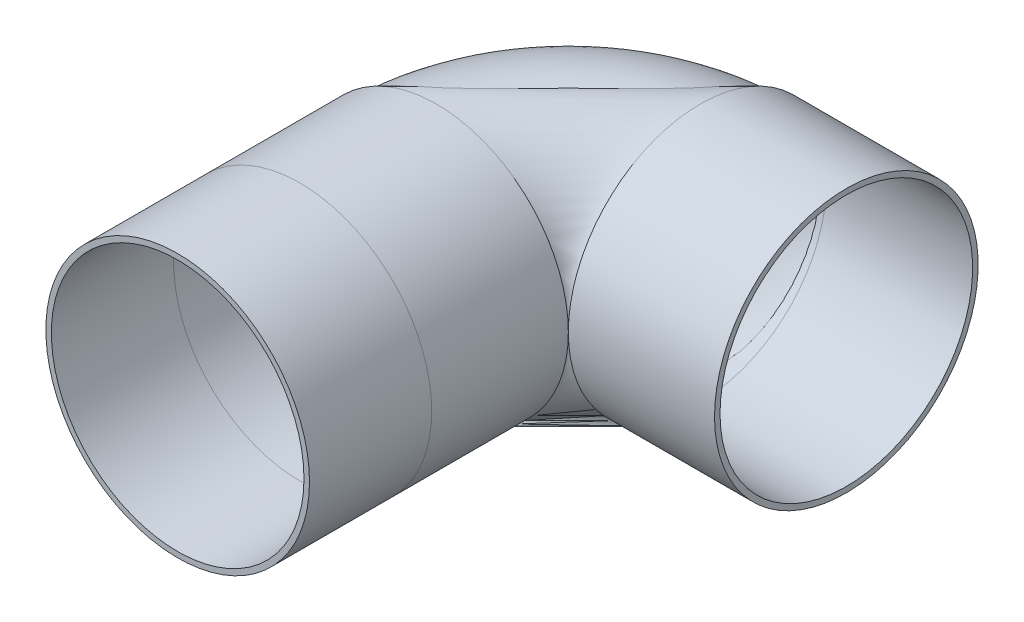
ISO-10303-21;
HEADER;
FILE_DESCRIPTION(('STEP AP214'),'2;1');
FILE_NAME('part.step','',(''),(''),'','','');
FILE_SCHEMA(('AUTOMOTIVE_DESIGN { 1 0 10303 214 1 1 1 1 }'));
ENDSEC;
DATA;
#1=APPLICATION_CONTEXT('core data for automotive mechanical design processes');
#2=APPLICATION_PROTOCOL_DEFINITION('international standard','automotive_design',2000,#1);
#3=PRODUCT_CONTEXT('',#1,'mechanical');
#4=PRODUCT('Part','Part','',(#3));
#5=PRODUCT_RELATED_PRODUCT_CATEGORY('part','',(#4));
#6=PRODUCT_DEFINITION_FORMATION('','',#4);
#7=PRODUCT_DEFINITION_CONTEXT('part definition',#1,'design');
#8=PRODUCT_DEFINITION('design','',#6,#7);
#9=PRODUCT_DEFINITION_SHAPE('','',#8);
#10=(LENGTH_UNIT() NAMED_UNIT(*) SI_UNIT(.MILLI.,.METRE.));
#11=(NAMED_UNIT(*) PLANE_ANGLE_UNIT() SI_UNIT($,.RADIAN.));
#12=(NAMED_UNIT(*) SI_UNIT($,.STERADIAN.) SOLID_ANGLE_UNIT());
#13=UNCERTAINTY_MEASURE_WITH_UNIT(LENGTH_MEASURE(1.E-05),#10,'distance_accuracy_value','');
#14=(GEOMETRIC_REPRESENTATION_CONTEXT(3) GLOBAL_UNCERTAINTY_ASSIGNED_CONTEXT((#13)) GLOBAL_UNIT_ASSIGNED_CONTEXT((#10,
#11,#12)) REPRESENTATION_CONTEXT('',''));
#15=CARTESIAN_POINT('',(0.,0.,0.));
#16=DIRECTION('',(0.,0.,1.));
#17=DIRECTION('',(1.,0.,0.));
#18=AXIS2_PLACEMENT_3D('',#15,#16,#17);
#19=CARTESIAN_POINT('',(116.,0.,-55.));
#20=DIRECTION('',(-1.,0.,0.));
#21=DIRECTION('',(0.,0.,1.));
#22=AXIS2_PLACEMENT_3D('',#19,#20,#21);
#23=CYLINDRICAL_SURFACE('',#22,55.);
#24=CARTESIAN_POINT('',(55.,0.,-55.));
#25=DIRECTION('',(-1.,0.,0.));
#26=DIRECTION('',(0.,0.,1.));
#27=AXIS2_PLACEMENT_3D('',#24,#25,#26);
#28=CIRCLE('',#27,55.);
#29=CARTESIAN_POINT('',(55.,0.,0.));
#30=VERTEX_POINT('',#29);
#31=EDGE_CURVE('E53',#30,#30,#28,.T.);
#32=ORIENTED_EDGE('',*,*,#31,.F.);
#33=EDGE_LOOP('',(#32));
#34=FACE_BOUND('',#33,.T.);
#35=CARTESIAN_POINT('',(116.,0.,-55.));
#36=DIRECTION('',(-1.,0.,0.));
#37=DIRECTION('',(0.,0.,1.));
#38=AXIS2_PLACEMENT_3D('',#35,#36,#37);
#39=CIRCLE('',#38,55.);
#40=CARTESIAN_POINT('',(116.,0.,0.));
#41=VERTEX_POINT('',#40);
#42=EDGE_CURVE('E63',#41,#41,#39,.T.);
#43=ORIENTED_EDGE('',*,*,#42,.T.);
#44=EDGE_LOOP('',(#43));
#45=FACE_BOUND('',#44,.T.);
#46=ADVANCED_FACE('F39',(#34,#45),#23,.T.);
#47=CARTESIAN_POINT('',(55.,0.,0.));
#48=DIRECTION('',(0.,1.,0.));
#49=DIRECTION('',(0.,0.,1.));
#50=AXIS2_PLACEMENT_3D('',#47,#48,#49);
#51=TOROIDAL_SURFACE('',#50,55.,55.);
#52=CARTESIAN_POINT('',(0.,0.,0.));
#53=DIRECTION('',(0.,0.,1.));
#54=DIRECTION('',(1.,0.,0.));
#55=AXIS2_PLACEMENT_3D('',#52,#53,#54);
#56=CIRCLE('',#55,55.);
#57=EDGE_CURVE('E59',#30,#30,#56,.T.);
#58=ORIENTED_EDGE('',*,*,#57,.F.);
#59=ORIENTED_EDGE('',*,*,#31,.T.);
#60=EDGE_LOOP('',(#58,#59));
#61=FACE_BOUND('',#60,.T.);
#62=ADVANCED_FACE('F96',(#61),#51,.T.);
#63=CARTESIAN_POINT('',(0.,0.,0.));
#64=DIRECTION('',(0.,0.,1.));
#65=DIRECTION('',(1.,0.,0.));
#66=AXIS2_PLACEMENT_3D('',#63,#64,#65);
#67=CYLINDRICAL_SURFACE('',#66,55.);
#68=CARTESIAN_POINT('',(0.,0.,57.));
#69=DIRECTION('',(0.,0.,1.));
#70=DIRECTION('',(1.,0.,0.));
#71=AXIS2_PLACEMENT_3D('',#68,#69,#70);
#72=CIRCLE('',#71,55.);
#73=CARTESIAN_POINT('',(55.,0.,57.));
#74=VERTEX_POINT('',#73);
#75=EDGE_CURVE('E43',#74,#74,#72,.T.);
#76=ORIENTED_EDGE('',*,*,#75,.F.);
#77=EDGE_LOOP('',(#76));
#78=FACE_BOUND('',#77,.T.);
#79=ORIENTED_EDGE('',*,*,#57,.T.);
#80=EDGE_LOOP('',(#79));
#81=FACE_BOUND('',#80,.T.);
#82=ADVANCED_FACE('F101',(#78,#81),#67,.T.);
#83=CARTESIAN_POINT('',(0.,0.,57.));
#84=DIRECTION('',(0.,0.,1.));
#85=DIRECTION('',(1.,0.,0.));
#86=AXIS2_PLACEMENT_3D('',#83,#84,#85);
#87=CYLINDRICAL_SURFACE('',#86,55.);
#88=CARTESIAN_POINT('',(0.,0.,108.));
#89=DIRECTION('',(0.,0.,1.));
#90=DIRECTION('',(1.,0.,0.));
#91=AXIS2_PLACEMENT_3D('',#88,#89,#90);
#92=CIRCLE('',#91,55.);
#93=CARTESIAN_POINT('',(55.,0.,108.));
#94=VERTEX_POINT('',#93);
#95=EDGE_CURVE('E67',#94,#94,#92,.T.);
#96=ORIENTED_EDGE('',*,*,#95,.F.);
#97=EDGE_LOOP('',(#96));
#98=FACE_BOUND('',#97,.T.);
#99=ORIENTED_EDGE('',*,*,#75,.T.);
#100=EDGE_LOOP('',(#99));
#101=FACE_BOUND('',#100,.T.);
#102=ADVANCED_FACE('F41',(#98,#101),#87,.T.);
#103=CARTESIAN_POINT('',(116.,0.,-55.));
#104=DIRECTION('',(-1.,0.,0.));
#105=DIRECTION('',(0.,0.,1.));
#106=AXIS2_PLACEMENT_3D('',#103,#104,#105);
#107=PLANE('',#106);
#108=CARTESIAN_POINT('',(116.,0.,-55.));
#109=DIRECTION('',(-1.,0.,0.));
#110=DIRECTION('',(0.,0.,1.));
#111=AXIS2_PLACEMENT_3D('',#108,#109,#110);
#112=CIRCLE('',#111,52.7);
#113=CARTESIAN_POINT('',(116.,0.,-2.3));
#114=VERTEX_POINT('',#113);
#115=EDGE_CURVE('E70',#114,#114,#112,.F.);
#116=ORIENTED_EDGE('',*,*,#115,.F.);
#117=EDGE_LOOP('',(#116));
#118=FACE_BOUND('',#117,.T.);
#119=ORIENTED_EDGE('',*,*,#42,.F.);
#120=EDGE_LOOP('',(#119));
#121=FACE_BOUND('',#120,.T.);
#122=ADVANCED_FACE('F89',(#118,#121),#107,.F.);
#123=CARTESIAN_POINT('',(0.,0.,108.));
#124=DIRECTION('',(0.,0.,1.));
#125=DIRECTION('',(1.,0.,0.));
#126=AXIS2_PLACEMENT_3D('',#123,#124,#125);
#127=PLANE('',#126);
#128=CARTESIAN_POINT('',(0.,0.,108.));
#129=DIRECTION('',(0.,0.,1.));
#130=DIRECTION('',(1.,0.,0.));
#131=AXIS2_PLACEMENT_3D('',#128,#129,#130);
#132=CIRCLE('',#131,52.7);
#133=CARTESIAN_POINT('',(52.7,0.,108.));
#134=VERTEX_POINT('',#133);
#135=EDGE_CURVE('E11',#134,#134,#132,.F.);
#136=ORIENTED_EDGE('',*,*,#135,.T.);
#137=EDGE_LOOP('',(#136));
#138=FACE_BOUND('',#137,.T.);
#139=ORIENTED_EDGE('',*,*,#95,.T.);
#140=EDGE_LOOP('',(#139));
#141=FACE_BOUND('',#140,.T.);
#142=ADVANCED_FACE('F92',(#138,#141),#127,.T.);
#143=CARTESIAN_POINT('',(116.,0.,-55.));
#144=DIRECTION('',(-1.,0.,0.));
#145=DIRECTION('',(0.,0.,1.));
#146=AXIS2_PLACEMENT_3D('',#143,#144,#145);
#147=CYLINDRICAL_SURFACE('',#146,52.7);
#148=CARTESIAN_POINT('',(55.,0.,-55.));
#149=DIRECTION('',(-1.,0.,0.));
#150=DIRECTION('',(0.,0.,1.));
#151=AXIS2_PLACEMENT_3D('',#148,#149,#150);
#152=CIRCLE('',#151,52.7);
#153=CARTESIAN_POINT('',(55.,0.,-107.7));
#154=VERTEX_POINT('',#153);
#155=EDGE_CURVE('E79',#154,#154,#152,.F.);
#156=ORIENTED_EDGE('',*,*,#155,.F.);
#157=EDGE_LOOP('',(#156));
#158=FACE_BOUND('',#157,.T.);
#159=ORIENTED_EDGE('',*,*,#115,.T.);
#160=EDGE_LOOP('',(#159));
#161=FACE_BOUND('',#160,.T.);
#162=ADVANCED_FACE('F87',(#158,#161),#147,.F.);
#163=CARTESIAN_POINT('',(55.,0.,0.));
#164=DIRECTION('',(0.,1.,0.));
#165=DIRECTION('',(0.,0.,1.));
#166=AXIS2_PLACEMENT_3D('',#163,#164,#165);
#167=TOROIDAL_SURFACE('',#166,55.,52.7);
#168=CARTESIAN_POINT('',(0.,0.,0.));
#169=DIRECTION('',(0.,0.,1.));
#170=DIRECTION('',(1.,0.,0.));
#171=AXIS2_PLACEMENT_3D('',#168,#169,#170);
#172=CIRCLE('',#171,52.7);
#173=CARTESIAN_POINT('',(-52.7,0.,0.));
#174=VERTEX_POINT('',#173);
#175=EDGE_CURVE('E75',#174,#174,#172,.F.);
#176=CARTESIAN_POINT('',(55.,0.,0.));
#177=DIRECTION('',(0.,1.,0.));
#178=DIRECTION('',(0.,0.,1.));
#179=AXIS2_PLACEMENT_3D('',#176,#177,#178);
#180=CIRCLE('',#179,107.7);
#181=EDGE_CURVE('',#154,#174,#180,.T.);
#182=ORIENTED_EDGE('',*,*,#155,.T.);
#183=ORIENTED_EDGE('',*,*,#175,.F.);
#184=ORIENTED_EDGE('',*,*,#181,.T.);
#185=ORIENTED_EDGE('',*,*,#181,.F.);
#186=EDGE_LOOP('',(#182,#184,#183,#185));
#187=FACE_BOUND('',#186,.T.);
#188=ADVANCED_FACE('F111',(#187),#167,.F.);
#189=CARTESIAN_POINT('',(0.,0.,0.));
#190=DIRECTION('',(0.,0.,1.));
#191=DIRECTION('',(1.,0.,0.));
#192=AXIS2_PLACEMENT_3D('',#189,#190,#191);
#193=CYLINDRICAL_SURFACE('',#192,52.7);
#194=CARTESIAN_POINT('',(0.,0.,57.));
#195=DIRECTION('',(0.,0.,1.));
#196=DIRECTION('',(1.,0.,0.));
#197=AXIS2_PLACEMENT_3D('',#194,#195,#196);
#198=CIRCLE('',#197,52.7);
#199=CARTESIAN_POINT('',(52.7,0.,57.));
#200=VERTEX_POINT('',#199);
#201=EDGE_CURVE('E48',#200,#200,#198,.F.);
#202=ORIENTED_EDGE('',*,*,#201,.F.);
#203=EDGE_LOOP('',(#202));
#204=FACE_BOUND('',#203,.T.);
#205=ORIENTED_EDGE('',*,*,#175,.T.);
#206=EDGE_LOOP('',(#205));
#207=FACE_BOUND('',#206,.T.);
#208=ADVANCED_FACE('F105',(#204,#207),#193,.F.);
#209=CARTESIAN_POINT('',(0.,0.,57.));
#210=DIRECTION('',(0.,0.,1.));
#211=DIRECTION('',(1.,0.,0.));
#212=AXIS2_PLACEMENT_3D('',#209,#210,#211);
#213=CYLINDRICAL_SURFACE('',#212,52.7);
#214=ORIENTED_EDGE('',*,*,#135,.F.);
#215=EDGE_LOOP('',(#214));
#216=FACE_BOUND('',#215,.T.);
#217=ORIENTED_EDGE('',*,*,#201,.T.);
#218=EDGE_LOOP('',(#217));
#219=FACE_BOUND('',#218,.T.);
#220=ADVANCED_FACE('F103',(#216,#219),#213,.F.);
#221=CLOSED_SHELL('',(#46,#62,#82,#102,#122,#142,#162,#188,#208,#220));
#222=MANIFOLD_SOLID_BREP('B2',#221);
#223=ADVANCED_BREP_SHAPE_REPRESENTATION('',(#18,#222),#14);
#224=SHAPE_DEFINITION_REPRESENTATION(#9,#223);
ENDSEC;
END-ISO-10303-21;
